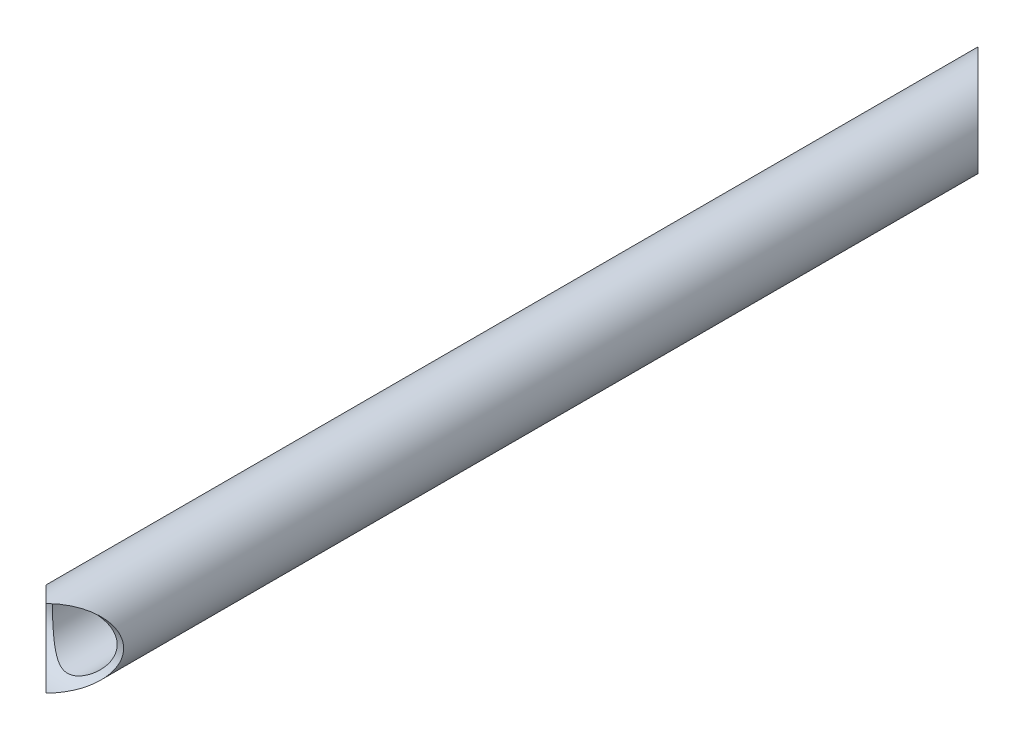
ISO-10303-21;
HEADER;
FILE_DESCRIPTION(('STEP AP214'),'2;1');
FILE_NAME('part.step','',(''),(''),'','','');
FILE_SCHEMA(('AUTOMOTIVE_DESIGN { 1 0 10303 214 1 1 1 1 }'));
ENDSEC;
DATA;
#1=APPLICATION_CONTEXT('core data for automotive mechanical design processes');
#2=APPLICATION_PROTOCOL_DEFINITION('international standard','automotive_design',2000,#1);
#3=PRODUCT_CONTEXT('',#1,'mechanical');
#4=PRODUCT('Part','Part','',(#3));
#5=PRODUCT_RELATED_PRODUCT_CATEGORY('part','',(#4));
#6=PRODUCT_DEFINITION_FORMATION('','',#4);
#7=PRODUCT_DEFINITION_CONTEXT('part definition',#1,'design');
#8=PRODUCT_DEFINITION('design','',#6,#7);
#9=PRODUCT_DEFINITION_SHAPE('','',#8);
#10=(LENGTH_UNIT() NAMED_UNIT(*) SI_UNIT(.MILLI.,.METRE.));
#11=(NAMED_UNIT(*) PLANE_ANGLE_UNIT() SI_UNIT($,.RADIAN.));
#12=(NAMED_UNIT(*) SI_UNIT($,.STERADIAN.) SOLID_ANGLE_UNIT());
#13=UNCERTAINTY_MEASURE_WITH_UNIT(LENGTH_MEASURE(1.E-05),#10,'distance_accuracy_value','');
#14=(GEOMETRIC_REPRESENTATION_CONTEXT(3) GLOBAL_UNCERTAINTY_ASSIGNED_CONTEXT((#13)) GLOBAL_UNIT_ASSIGNED_CONTEXT((#10,
#11,#12)) REPRESENTATION_CONTEXT('',''));
#15=CARTESIAN_POINT('',(0.,0.,0.));
#16=DIRECTION('',(0.,0.,1.));
#17=DIRECTION('',(1.,0.,0.));
#18=AXIS2_PLACEMENT_3D('',#15,#16,#17);
#19=CARTESIAN_POINT('',(0.,0.,375.));
#20=DIRECTION('',(0.,0.,-1.));
#21=DIRECTION('',(-1.,0.,0.));
#22=AXIS2_PLACEMENT_3D('',#19,#20,#21);
#23=CYLINDRICAL_SURFACE('',#22,15.);
#24=CARTESIAN_POINT('',(0.,0.,15.));
#25=DIRECTION('',(-0.707106781186547,0.,0.707106781186547));
#26=DIRECTION('',(-0.707106781186548,0.,-0.707106781186548));
#27=AXIS2_PLACEMENT_3D('',#24,#25,#26);
#28=ELLIPSE('',#27,21.2132034355964,15.);
#29=CARTESIAN_POINT('',(-15.,0.,0.));
#30=VERTEX_POINT('',#29);
#31=EDGE_CURVE('E11',#30,#30,#28,.T.);
#32=ORIENTED_EDGE('',*,*,#31,.T.);
#33=EDGE_LOOP('',(#32));
#34=FACE_BOUND('',#33,.T.);
#35=CARTESIAN_POINT('',(0.,0.,375.));
#36=DIRECTION('',(0.707106781186547,0.,-0.707106781186548));
#37=DIRECTION('',(-0.707106781186548,0.,-0.707106781186547));
#38=AXIS2_PLACEMENT_3D('',#35,#36,#37);
#39=ELLIPSE('',#38,21.2132034355964,15.);
#40=CARTESIAN_POINT('',(0.,-15.,375.));
#41=VERTEX_POINT('',#40);
#42=CARTESIAN_POINT('',(0.,15.,375.));
#43=VERTEX_POINT('',#42);
#44=EDGE_CURVE('E52',#41,#43,#39,.T.);
#45=ORIENTED_EDGE('',*,*,#44,.T.);
#46=CARTESIAN_POINT('',(0.,0.,375.));
#47=DIRECTION('',(-0.707106781186548,0.,-0.707106781186547));
#48=DIRECTION('',(0.707106781186547,0.,-0.707106781186548));
#49=AXIS2_PLACEMENT_3D('',#46,#47,#48);
#50=ELLIPSE('',#49,21.2132034355964,15.);
#51=EDGE_CURVE('E55',#43,#41,#50,.T.);
#52=ORIENTED_EDGE('',*,*,#51,.T.);
#53=EDGE_LOOP('',(#45,#52));
#54=FACE_BOUND('',#53,.T.);
#55=ADVANCED_FACE('F34',(#34,#54),#23,.T.);
#56=CARTESIAN_POINT('',(0.,0.,0.));
#57=DIRECTION('',(0.,0.,1.));
#58=DIRECTION('',(1.,0.,0.));
#59=AXIS2_PLACEMENT_3D('',#56,#57,#58);
#60=CYLINDRICAL_SURFACE('',#59,12.5);
#61=CARTESIAN_POINT('',(12.5,0.,360.));
#62=CARTESIAN_POINT('',(12.499998327598,0.296923312070199,360.000001628299));
#63=CARTESIAN_POINT('',(12.4894018329695,0.593871646199226,360.008835294159));
#64=CARTESIAN_POINT('',(12.447212805508,1.18524340872445,360.043965343822));
#65=CARTESIAN_POINT('',(12.4156178653242,1.4796665437006,360.070263729856));
#66=CARTESIAN_POINT('',(12.3319931563994,2.06374265528197,360.139733730989));
#67=CARTESIAN_POINT('',(12.2799512963895,2.35339270353323,360.182915329888));
#68=CARTESIAN_POINT('',(12.1563384657553,2.92559798223805,360.285199235222));
#69=CARTESIAN_POINT('',(12.0847676180795,3.20815325734589,360.344301441426));
#70=CARTESIAN_POINT('',(11.9237184026342,3.76268614115297,360.476812340665));
#71=CARTESIAN_POINT('',(11.8343512259831,4.03471749052374,360.550132131372));
#72=CARTESIAN_POINT('',(11.6386789994061,4.56858722555237,360.709945322421));
#73=CARTESIAN_POINT('',(11.5323742762919,4.83042580775941,360.796438468579));
#74=CARTESIAN_POINT('',(11.3040820620139,5.3428854482847,360.981163722367));
#75=CARTESIAN_POINT('',(11.1820931636612,5.59350549734943,361.079396883258));
#76=CARTESIAN_POINT('',(10.923654693615,6.08279150482868,361.286130291462));
#77=CARTESIAN_POINT('',(10.7872020497487,6.32145490767391,361.394632719493));
#78=CARTESIAN_POINT('',(10.4483850957329,6.87172088229645,361.661924695893));
#79=CARTESIAN_POINT('',(10.2402216276012,7.17791172318056,361.82454546015));
#80=CARTESIAN_POINT('',(9.80150350011505,7.76629297181086,362.162558774791));
#81=CARTESIAN_POINT('',(9.5709412622383,8.04847519535038,362.337955642853));
#82=CARTESIAN_POINT('',(9.08883679233335,8.58921346069625,362.698324346844));
#83=CARTESIAN_POINT('',(8.83724320388206,8.84770823448305,362.883319176363));
#84=CARTESIAN_POINT('',(8.31501637969841,9.34019959391547,363.258767904941));
#85=CARTESIAN_POINT('',(8.04438554382026,9.57419925821838,363.449221114124));
#86=CARTESIAN_POINT('',(7.47967203795309,10.0218125911242,363.835225898419));
#87=CARTESIAN_POINT('',(7.18524949852085,10.2349719764474,364.030806806389));
#88=CARTESIAN_POINT('',(6.57744459654826,10.635779118778,364.418978606491));
#89=CARTESIAN_POINT('',(6.26405593562713,10.8234183329756,364.611568478364));
#90=CARTESIAN_POINT('',(5.61867942983195,11.1720493988886,364.98746586417));
#91=CARTESIAN_POINT('',(5.28673794785468,11.3331040206685,365.17079451307));
#92=CARTESIAN_POINT('',(4.6027317422976,11.6276971295169,365.521134357113));
#93=CARTESIAN_POINT('',(4.25068449447843,11.7612590616548,365.688159391111));
#94=CARTESIAN_POINT('',(3.68991851965006,11.9447893738677,365.926224896092));
#95=CARTESIAN_POINT('',(3.4884952061355,12.0052217887659,366.006477644754));
#96=CARTESIAN_POINT('',(3.07935445316773,12.1166220639299,366.157136814699));
#97=CARTESIAN_POINT('',(2.87163619943739,12.1675886936255,366.227541955481));
#98=CARTESIAN_POINT('',(2.45067564620355,12.2593021614932,366.356172472944));
#99=CARTESIAN_POINT('',(2.23744491234005,12.3000687406316,366.414421339783));
#100=CARTESIAN_POINT('',(1.80590087059668,12.3707917006533,366.516640640715));
#101=CARTESIAN_POINT('',(1.58759030842622,12.4007537833624,366.560618604719));
#102=CARTESIAN_POINT('',(1.14419394692467,12.4495452539764,366.632756553967));
#103=CARTESIAN_POINT('',(0.919057202004624,12.4682273289794,366.660706998403));
#104=CARTESIAN_POINT('',(0.466579216643819,12.4933433691716,366.698379913962));
#105=CARTESIAN_POINT('',(0.239238184335239,12.4997784796336,366.708104089511));
#106=CARTESIAN_POINT('',(-0.215485574864381,12.5002102366344,366.708754947858));
#107=CARTESIAN_POINT('',(-0.442868301844219,12.4942068563681,366.699681590147));
#108=CARTESIAN_POINT('',(-0.89550021844179,12.4699428329517,366.663274490223));
#109=CARTESIAN_POINT('',(-1.1207491447857,12.4516806967561,366.635938523731));
#110=CARTESIAN_POINT('',(-1.58579226858129,12.4013871265877,366.561531022215));
#111=CARTESIAN_POINT('',(-1.82524278944333,12.3683390276231,366.51301028871));
#112=CARTESIAN_POINT('',(-2.29780876645785,12.2893260258258,366.398995267168));
#113=CARTESIAN_POINT('',(-2.53092321811809,12.2433590878467,366.333498304938));
#114=CARTESIAN_POINT('',(-3.22066971512812,12.0871786252073,366.115641372478));
#115=CARTESIAN_POINT('',(-3.66661312245272,11.9588103853178,365.942114332722));
#116=CARTESIAN_POINT('',(-4.43920195113387,11.6908057009429,365.599878210563));
#117=CARTESIAN_POINT('',(-4.77155675129365,11.5588798811882,365.437480115445));
#118=CARTESIAN_POINT('',(-5.4182584982866,11.2702170140679,365.098904215078));
#119=CARTESIAN_POINT('',(-5.7325947368907,11.1134654170124,364.922718360035));
#120=CARTESIAN_POINT('',(-6.34415710288478,10.7760769566678,364.562703044659));
#121=CARTESIAN_POINT('',(-6.64135948979246,10.595408043873,364.378863559041));
#122=CARTESIAN_POINT('',(-7.21858921184125,10.2108848026406,364.008682207211));
#123=CARTESIAN_POINT('',(-7.4986199791168,10.007035130802,363.822340850191));
#124=CARTESIAN_POINT('',(-8.05565232744104,9.56500977328087,363.441448357563));
#125=CARTESIAN_POINT('',(-8.33172846911312,9.32559600390717,363.24697791394));
#126=CARTESIAN_POINT('',(-8.8640000801883,8.82121968518678,362.863838752079));
#127=CARTESIAN_POINT('',(-9.12019258965628,8.55625334512575,362.675170900144));
#128=CARTESIAN_POINT('',(-9.6106724662555,8.00136408219443,362.307928703109));
#129=CARTESIAN_POINT('',(-9.84500013514057,7.71148904588992,362.129336037583));
#130=CARTESIAN_POINT('',(-10.290086966353,7.10668450823461,361.785769242059));
#131=CARTESIAN_POINT('',(-10.5008540892619,6.79176353127313,361.620790517177));
#132=CARTESIAN_POINT('',(-10.8477822981447,6.21763463524109,361.346573976025));
#133=CARTESIAN_POINT('',(-10.9895874757636,5.96362185269396,361.233567675348));
#134=CARTESIAN_POINT('',(-11.2568234595736,5.44239412631552,361.019309960238));
#135=CARTESIAN_POINT('',(-11.382258130559,5.17518231915554,360.918055771962));
#136=CARTESIAN_POINT('',(-11.6152767269038,4.62856137888215,360.729050027951));
#137=CARTESIAN_POINT('',(-11.7228666400565,4.34915637709624,360.64129394366));
#138=CARTESIAN_POINT('',(-11.9187593560109,3.77940562745319,360.480920827242));
#139=CARTESIAN_POINT('',(-12.007061846147,3.48905970232379,360.408304040539));
#140=CARTESIAN_POINT('',(-12.1635639714973,2.89692909479524,360.279255728808));
#141=CARTESIAN_POINT('',(-12.2316022563545,2.59507312032775,360.222954202309));
#142=CARTESIAN_POINT('',(-12.3453959634454,1.98435462821098,360.128625241174));
#143=CARTESIAN_POINT('',(-12.3911513359585,1.6754920949294,360.090597847314));
#144=CARTESIAN_POINT('',(-12.4594422471987,1.05361006429706,360.033793348249));
#145=CARTESIAN_POINT('',(-12.481990033622,0.740592848002779,360.015006089179));
#146=CARTESIAN_POINT('',(-12.5034263568659,0.113203263560425,359.997145835199));
#147=CARTESIAN_POINT('',(-12.5023174680047,-0.201168953414195,359.998070695219));
#148=CARTESIAN_POINT('',(-12.4780307839524,-0.790600115481619,360.018303838544));
#149=CARTESIAN_POINT('',(-12.4575160827473,-1.06585154136053,360.035393745017));
#150=CARTESIAN_POINT('',(-12.3985383859714,-1.61305798508725,360.084454920825));
#151=CARTESIAN_POINT('',(-12.3600771134078,-1.88501331681407,360.116424761573));
#152=CARTESIAN_POINT('',(-12.265803749893,-2.42381386934885,360.194620923758));
#153=CARTESIAN_POINT('',(-12.2099907384938,-2.69065881827183,360.24084800149));
#154=CARTESIAN_POINT('',(-12.0818222266148,-3.21762543938393,360.346702642294));
#155=CARTESIAN_POINT('',(-12.0094659124275,-3.47774678016145,360.406330864519));
#156=CARTESIAN_POINT('',(-11.8481140382859,-3.99325659297309,360.538822366875));
#157=CARTESIAN_POINT('',(-11.7589132312238,-4.24853866763169,360.611848548075));
#158=CARTESIAN_POINT('',(-11.5655403781605,-4.74978694571591,360.769448892646));
#159=CARTESIAN_POINT('',(-11.4613625581372,-4.99574950980772,360.854027509146));
#160=CARTESIAN_POINT('',(-11.2391432923867,-5.47740828299163,361.033466984271));
#161=CARTESIAN_POINT('',(-11.121102562637,-5.71310502142148,361.128327311857));
#162=CARTESIAN_POINT('',(-10.872177841229,-6.17367827294094,361.327083692754));
#163=CARTESIAN_POINT('',(-10.7412912736101,-6.39855260229649,361.430981557875));
#164=CARTESIAN_POINT('',(-10.4061203377276,-6.93563147461018,361.69502434713));
#165=CARTESIAN_POINT('',(-10.1952847547452,-7.24166688197106,361.859463568049));
#166=CARTESIAN_POINT('',(-9.75115777896624,-7.8294787388767,362.200980349838));
#167=CARTESIAN_POINT('',(-9.51785774982544,-8.11124577906872,362.378062764501));
#168=CARTESIAN_POINT('',(-9.03011991488748,-8.6509893235078,362.741674473948));
#169=CARTESIAN_POINT('',(-8.77562408095413,-8.90889614562888,362.928229117851));
#170=CARTESIAN_POINT('',(-8.24748352233279,-9.39994891688829,363.306540134511));
#171=CARTESIAN_POINT('',(-7.97384150565558,-9.63309835598109,363.498295769307));
#172=CARTESIAN_POINT('',(-7.403034631104,-10.0786170078215,363.886481398753));
#173=CARTESIAN_POINT('',(-7.10553642627211,-10.2905396238018,364.082933629487));
#174=CARTESIAN_POINT('',(-6.49136811879987,-10.6885973181745,364.472351095951));
#175=CARTESIAN_POINT('',(-6.17469117595232,-10.8747231172231,364.665315055328));
#176=CARTESIAN_POINT('',(-5.52257462133321,-11.2199362721708,365.041187782156));
#177=CARTESIAN_POINT('',(-5.18718769967727,-11.3790949218182,365.224122169614));
#178=CARTESIAN_POINT('',(-4.4960106926098,-11.6694553397696,365.572640315251));
#179=CARTESIAN_POINT('',(-4.14023968667759,-11.8006827261947,365.738239901163));
#180=CARTESIAN_POINT('',(-3.57627674800764,-11.9792820500161,365.971848833586));
#181=CARTESIAN_POINT('',(-3.37553393356546,-12.0374486237395,366.049692253789));
#182=CARTESIAN_POINT('',(-2.96790261394004,-12.1443795281648,366.195331338566));
#183=CARTESIAN_POINT('',(-2.76101336226526,-12.1931427113827,366.263125776642));
#184=CARTESIAN_POINT('',(-2.34192387398329,-12.2805172481157,366.386370824388));
#185=CARTESIAN_POINT('',(-2.12973522282391,-12.3191489305144,366.441846117618));
#186=CARTESIAN_POINT('',(-1.70053312153341,-12.3856895519206,366.538431335006));
#187=CARTESIAN_POINT('',(-1.48352225215847,-12.4136040869729,366.579548755224));
#188=CARTESIAN_POINT('',(-1.04320812495497,-12.4583809597523,366.645936035433));
#189=CARTESIAN_POINT('',(-0.819860513427517,-12.4751056097857,366.671008307878));
#190=CARTESIAN_POINT('',(-0.371295533265921,-12.4965012122631,366.703142756322));
#191=CARTESIAN_POINT('',(-0.146078323203315,-12.5011731766954,366.710206444389));
#192=CARTESIAN_POINT('',(0.304151810809337,-12.4983270737914,366.705916227757));
#193=CARTESIAN_POINT('',(0.529164679003456,-12.4908063279404,366.694558276164));
#194=CARTESIAN_POINT('',(0.976852461873857,-12.46379069103,366.654072780208));
#195=CARTESIAN_POINT('',(1.1995270637158,-12.4442942179972,366.624942888206));
#196=CARTESIAN_POINT('',(1.66424152774502,-12.3911519168957,366.546491080388));
#197=CARTESIAN_POINT('',(1.90582617380603,-12.3562231793168,366.495353118546));
#198=CARTESIAN_POINT('',(2.38237295282901,-12.2732581037799,366.376055236582));
#199=CARTESIAN_POINT('',(2.61733387176253,-12.2252193799733,366.307892218311));
#200=CARTESIAN_POINT('',(3.31226280753748,-12.0625723366001,366.082124033487));
#201=CARTESIAN_POINT('',(3.76118560878234,-11.9295650271176,365.903449118467));
#202=CARTESIAN_POINT('',(4.53901328498351,-11.6525333453672,365.552357295932));
#203=CARTESIAN_POINT('',(4.87371393843926,-11.5162973775245,365.386105300232));
#204=CARTESIAN_POINT('',(5.52473679367151,-11.2185266211043,365.040244612775));
#205=CARTESIAN_POINT('',(5.84104816254915,-11.0569771235912,364.860628187417));
#206=CARTESIAN_POINT('',(6.45618757286708,-10.7094647902715,364.49422694271));
#207=CARTESIAN_POINT('',(6.75499154632187,-10.5234694360212,364.307432813843));
#208=CARTESIAN_POINT('',(7.33499851158382,-10.1277334392379,363.93187280789));
#209=CARTESIAN_POINT('',(7.61620503496639,-9.91799758499403,363.743107335359));
#210=CARTESIAN_POINT('',(8.17425707261824,-9.46399415869412,363.358451641282));
#211=CARTESIAN_POINT('',(8.45020896468304,-9.21853603299085,363.162667229635));
#212=CARTESIAN_POINT('',(8.98165871337232,-8.7015641131812,362.777615174976));
#213=CARTESIAN_POINT('',(9.23715334511498,-8.43004622578967,362.588348562099));
#214=CARTESIAN_POINT('',(9.72550669601159,-7.86159349217998,362.220730937697));
#215=CARTESIAN_POINT('',(9.95840756239672,-7.56470799324316,362.042359840915));
#216=CARTESIAN_POINT('',(10.3997411526791,-6.94548776625941,361.700179903171));
#217=CARTESIAN_POINT('',(10.6081832181838,-6.62316283354532,361.536365508372));
#218=CARTESIAN_POINT('',(10.947262061244,-6.04067606389054,361.267379983591));
#219=CARTESIAN_POINT('',(11.0840702241094,-5.78602780920797,361.158007067299));
#220=CARTESIAN_POINT('',(11.3413118620988,-5.2639603494182,360.951174341012));
#221=CARTESIAN_POINT('',(11.4617489991489,-4.99654401846081,360.853711867345));
#222=CARTESIAN_POINT('',(11.684725829009,-4.45018573917805,360.672452827899));
#223=CARTESIAN_POINT('',(11.7872830097129,-4.17125538649918,360.588642914255));
#224=CARTESIAN_POINT('',(11.9731982666466,-3.60303104563933,360.436187190036));
#225=CARTESIAN_POINT('',(12.0565590090701,-3.31373850312036,360.367539273667));
#226=CARTESIAN_POINT('',(12.190292660109,-2.77664966061567,360.257134955182));
#227=CARTESIAN_POINT('',(12.2438657904865,-2.53017700409109,360.212789838766));
#228=CARTESIAN_POINT('',(12.336223067746,-2.03263262674728,360.136227575841));
#229=CARTESIAN_POINT('',(12.3750092183442,-1.78156153387683,360.104008786156));
#230=CARTESIAN_POINT('',(12.4372833672727,-1.27623778078261,360.052233686427));
#231=CARTESIAN_POINT('',(12.4607719960473,-1.02198525211294,360.032676854557));
#232=CARTESIAN_POINT('',(12.4921319727408,-0.511828141985496,360.006558527766));
#233=CARTESIAN_POINT('',(12.5000014414725,-0.255923365456306,359.99999859654));
#234=CARTESIAN_POINT('',(12.5,0.,360.));
#235=B_SPLINE_CURVE_WITH_KNOTS('',3,(#61,#62,#63,#64,#65,#66,#67,#68,#69,#70,#71,#72,#73,#74,
#75,#76,#77,#78,#79,#80,#81,#82,#83,#84,#85,#86,#87,#88,#89,#90,#91,#92,#93,#94,#95,#96,#97,#98,
#99,#100,#101,#102,#103,#104,#105,#106,#107,#108,#109,#110,#111,#112,#113,#114,#115,#116,#117,
#118,#119,#120,#121,#122,#123,#124,#125,#126,#127,#128,#129,#130,#131,#132,#133,#134,#135,#136,
#137,#138,#139,#140,#141,#142,#143,#144,#145,#146,#147,#148,#149,#150,#151,#152,#153,#154,#155,
#156,#157,#158,#159,#160,#161,#162,#163,#164,#165,#166,#167,#168,#169,#170,#171,#172,#173,#174,
#175,#176,#177,#178,#179,#180,#181,#182,#183,#184,#185,#186,#187,#188,#189,#190,#191,#192,#193,
#194,#195,#196,#197,#198,#199,#200,#201,#202,#203,#204,#205,#206,#207,#208,#209,#210,#211,#212,
#213,#214,#215,#216,#217,#218,#219,#220,#221,#222,#223,#224,#225,#226,#227,#228,#229,#230,#231,
#232,#233,#234),.UNSPECIFIED.,.T.,.F.,(4,2,2,2,2,2,2,2,2,2,2,2,2,2,2,2,2,2,2,2,2,2,2,2,2,2,2,2,
2,2,2,2,2,2,2,2,2,2,2,2,2,2,2,2,2,2,2,2,2,2,2,2,2,2,2,2,2,2,2,2,2,2,2,2,2,2,2,2,2,2,2,2,2,2,2,2,
2,2,2,2,2,2,2,2,2,2,4),(0.,0.89049632772269,1.78109476332718,2.67222064816241,3.56334092287135,
4.44905895797116,5.33475990512298,6.22054037315428,7.1065093638958,8.31793264103789,
9.52976723481377,10.7446526556017,11.9593852002437,13.1964670656073,14.4339620269412,
15.6684919413966,16.9019646781947,17.5768149755148,18.2517529433473,18.9253743663625,
19.5986397790479,20.280517637783,20.9623317276903,21.6441472869178,22.3260459023995,
23.0645180445769,23.803106585934,25.2835918051768,26.4604393187565,27.6379791194064,
28.8171131197453,29.9960106702444,31.2366027627229,32.4773791805205,33.7158214234631,
34.9538439515602,35.8892843253317,36.8245034567352,37.7594081384926,38.694327974727,
39.6365043057087,40.5786827389825,41.5203636865945,42.4619421610537,43.2905793946018,
44.1191370890494,44.9477387430364,45.7763811618238,46.615861377997,47.4556661075397,
48.2954274827627,49.1353575997354,50.3527496263854,51.5706115562677,52.7919247494843,
54.0130655496141,55.2560617222418,56.4995038575998,57.7396055671636,58.9785649261597,
59.6472285655574,60.3159737495773,60.9833666467614,61.6504105838739,62.3255183093789,
63.0005693484886,63.675768704019,64.35105727144,65.0980707831753,65.8452203325021,
67.3428347823569,68.5348053464573,69.7274711152123,70.9217397635806,72.1157679642776,
73.3684812213694,74.6213915689274,75.8719178397658,77.1219649287633,78.0483459197856,
78.9745193526002,79.8997817756926,80.8249156114598,81.5924932314998,82.3599668035974,
83.1274087444327,83.8949430128885),.UNSPECIFIED.);
#236=CARTESIAN_POINT('',(12.5,0.,360.));
#237=VERTEX_POINT('',#236);
#238=EDGE_CURVE('E37',#237,#237,#235,.T.);
#239=ORIENTED_EDGE('',*,*,#238,.T.);
#240=EDGE_LOOP('',(#239));
#241=FACE_BOUND('',#240,.T.);
#242=CARTESIAN_POINT('',(0.,0.,15.));
#243=DIRECTION('',(-0.707106781186547,0.,0.707106781186547));
#244=DIRECTION('',(0.707106781186548,0.,0.707106781186548));
#245=AXIS2_PLACEMENT_3D('',#242,#243,#244);
#246=ELLIPSE('',#245,17.6776695296637,12.5);
#247=CARTESIAN_POINT('',(12.5,0.,27.5));
#248=VERTEX_POINT('',#247);
#249=EDGE_CURVE('E45',#248,#248,#246,.F.);
#250=ORIENTED_EDGE('',*,*,#249,.T.);
#251=EDGE_LOOP('',(#250));
#252=FACE_BOUND('',#251,.T.);
#253=ADVANCED_FACE('F63',(#241,#252),#60,.F.);
#254=CARTESIAN_POINT('',(-15.,-15.,0.));
#255=DIRECTION('',(-0.707106781186547,0.,0.707106781186547));
#256=DIRECTION('',(0.707106781186548,0.,0.707106781186548));
#257=AXIS2_PLACEMENT_3D('',#254,#255,#256);
#258=PLANE('',#257);
#259=ORIENTED_EDGE('',*,*,#249,.F.);
#260=EDGE_LOOP('',(#259));
#261=FACE_BOUND('',#260,.T.);
#262=ORIENTED_EDGE('',*,*,#31,.F.);
#263=EDGE_LOOP('',(#262));
#264=FACE_BOUND('',#263,.T.);
#265=ADVANCED_FACE('F65',(#261,#264),#258,.F.);
#266=CARTESIAN_POINT('',(-15.,0.,375.));
#267=DIRECTION('',(1.,0.,0.));
#268=DIRECTION('',(0.,0.,-1.));
#269=AXIS2_PLACEMENT_3D('',#266,#267,#268);
#270=CYLINDRICAL_SURFACE('',#269,15.);
#271=ORIENTED_EDGE('',*,*,#238,.F.);
#272=EDGE_LOOP('',(#271));
#273=FACE_BOUND('',#272,.T.);
#274=ORIENTED_EDGE('',*,*,#51,.F.);
#275=ORIENTED_EDGE('',*,*,#44,.F.);
#276=EDGE_LOOP('',(#274,#275));
#277=FACE_BOUND('',#276,.T.);
#278=ADVANCED_FACE('F57',(#273,#277),#270,.F.);
#279=CLOSED_SHELL('',(#55,#253,#265,#278));
#280=MANIFOLD_SOLID_BREP('B2',#279);
#281=ADVANCED_BREP_SHAPE_REPRESENTATION('',(#18,#280),#14);
#282=SHAPE_DEFINITION_REPRESENTATION(#9,#281);
ENDSEC;
END-ISO-10303-21;
